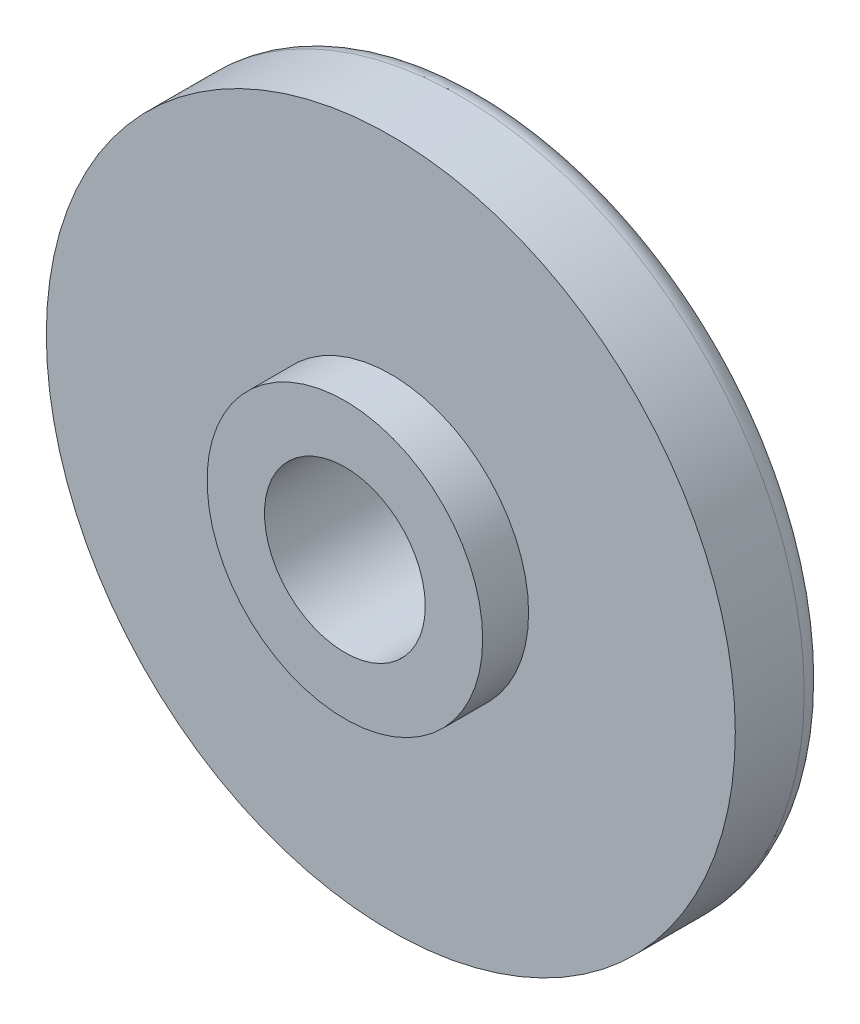
ISO-10303-21;
HEADER;
FILE_DESCRIPTION(('STEP AP214'),'2;1');
FILE_NAME('part.step','',(''),(''),'','','');
FILE_SCHEMA(('AUTOMOTIVE_DESIGN { 1 0 10303 214 1 1 1 1 }'));
ENDSEC;
DATA;
#1=APPLICATION_CONTEXT('core data for automotive mechanical design processes');
#2=APPLICATION_PROTOCOL_DEFINITION('international standard','automotive_design',2000,#1);
#3=PRODUCT_CONTEXT('',#1,'mechanical');
#4=PRODUCT('Part','Part','',(#3));
#5=PRODUCT_RELATED_PRODUCT_CATEGORY('part','',(#4));
#6=PRODUCT_DEFINITION_FORMATION('','',#4);
#7=PRODUCT_DEFINITION_CONTEXT('part definition',#1,'design');
#8=PRODUCT_DEFINITION('design','',#6,#7);
#9=PRODUCT_DEFINITION_SHAPE('','',#8);
#10=(LENGTH_UNIT() NAMED_UNIT(*) SI_UNIT(.MILLI.,.METRE.));
#11=(NAMED_UNIT(*) PLANE_ANGLE_UNIT() SI_UNIT($,.RADIAN.));
#12=(NAMED_UNIT(*) SI_UNIT($,.STERADIAN.) SOLID_ANGLE_UNIT());
#13=UNCERTAINTY_MEASURE_WITH_UNIT(LENGTH_MEASURE(1.E-05),#10,'distance_accuracy_value','');
#14=(GEOMETRIC_REPRESENTATION_CONTEXT(3) GLOBAL_UNCERTAINTY_ASSIGNED_CONTEXT((#13)) GLOBAL_UNIT_ASSIGNED_CONTEXT((#10,
#11,#12)) REPRESENTATION_CONTEXT('',''));
#15=CARTESIAN_POINT('',(0.,0.,0.));
#16=DIRECTION('',(0.,0.,1.));
#17=DIRECTION('',(1.,0.,0.));
#18=AXIS2_PLACEMENT_3D('',#15,#16,#17);
#19=CARTESIAN_POINT('',(0.,0.,2.));
#20=DIRECTION('',(0.,0.,1.));
#21=DIRECTION('',(1.,0.,0.));
#22=AXIS2_PLACEMENT_3D('',#19,#20,#21);
#23=PLANE('',#22);
#24=CARTESIAN_POINT('',(0.,0.,2.));
#25=DIRECTION('',(0.,0.,1.));
#26=DIRECTION('',(1.,0.,0.));
#27=AXIS2_PLACEMENT_3D('',#24,#25,#26);
#28=CIRCLE('',#27,7.5);
#29=CARTESIAN_POINT('',(7.5,0.,2.));
#30=VERTEX_POINT('',#29);
#31=EDGE_CURVE('E46',#30,#30,#28,.T.);
#32=ORIENTED_EDGE('',*,*,#31,.T.);
#33=EDGE_LOOP('',(#32));
#34=FACE_BOUND('',#33,.T.);
#35=CARTESIAN_POINT('',(0.,0.,2.));
#36=DIRECTION('',(0.,0.,1.));
#37=DIRECTION('',(1.,0.,0.));
#38=AXIS2_PLACEMENT_3D('',#35,#36,#37);
#39=CIRCLE('',#38,3.);
#40=CARTESIAN_POINT('',(3.,0.,2.));
#41=VERTEX_POINT('',#40);
#42=EDGE_CURVE('E56',#41,#41,#39,.T.);
#43=ORIENTED_EDGE('',*,*,#42,.F.);
#44=EDGE_LOOP('',(#43));
#45=FACE_BOUND('',#44,.T.);
#46=ADVANCED_FACE('F35',(#34,#45),#23,.T.);
#47=CARTESIAN_POINT('',(0.,0.,0.));
#48=DIRECTION('',(0.,0.,1.));
#49=DIRECTION('',(1.,0.,0.));
#50=AXIS2_PLACEMENT_3D('',#47,#48,#49);
#51=PLANE('',#50);
#52=CARTESIAN_POINT('',(0.,0.,0.));
#53=DIRECTION('',(0.,0.,1.));
#54=DIRECTION('',(1.,0.,0.));
#55=AXIS2_PLACEMENT_3D('',#52,#53,#54);
#56=CIRCLE('',#55,7.);
#57=CARTESIAN_POINT('',(7.,0.,0.));
#58=VERTEX_POINT('',#57);
#59=EDGE_CURVE('E10',#58,#58,#56,.F.);
#60=ORIENTED_EDGE('',*,*,#59,.T.);
#61=EDGE_LOOP('',(#60));
#62=FACE_BOUND('',#61,.T.);
#63=CARTESIAN_POINT('',(0.,0.,0.));
#64=DIRECTION('',(0.,0.,1.));
#65=DIRECTION('',(1.,0.,0.));
#66=AXIS2_PLACEMENT_3D('',#63,#64,#65);
#67=CIRCLE('',#66,1.75);
#68=CARTESIAN_POINT('',(1.75,0.,0.));
#69=VERTEX_POINT('',#68);
#70=EDGE_CURVE('E50',#69,#69,#67,.T.);
#71=ORIENTED_EDGE('',*,*,#70,.T.);
#72=EDGE_LOOP('',(#71));
#73=FACE_BOUND('',#72,.T.);
#74=ADVANCED_FACE('F82',(#62,#73),#51,.F.);
#75=CARTESIAN_POINT('',(0.,0.,2.));
#76=DIRECTION('',(0.,0.,-1.));
#77=DIRECTION('',(-1.,0.,0.));
#78=AXIS2_PLACEMENT_3D('',#75,#76,#77);
#79=CYLINDRICAL_SURFACE('',#78,7.5);
#80=CARTESIAN_POINT('',(0.,0.,0.5));
#81=DIRECTION('',(0.,0.,1.));
#82=DIRECTION('',(1.,0.,0.));
#83=AXIS2_PLACEMENT_3D('',#80,#81,#82);
#84=CIRCLE('',#83,7.5);
#85=CARTESIAN_POINT('',(7.5,0.,0.5));
#86=VERTEX_POINT('',#85);
#87=EDGE_CURVE('E42',#86,#86,#84,.T.);
#88=ORIENTED_EDGE('',*,*,#87,.T.);
#89=EDGE_LOOP('',(#88));
#90=FACE_BOUND('',#89,.T.);
#91=ORIENTED_EDGE('',*,*,#31,.F.);
#92=EDGE_LOOP('',(#91));
#93=FACE_BOUND('',#92,.T.);
#94=ADVANCED_FACE('F78',(#90,#93),#79,.T.);
#95=CARTESIAN_POINT('',(0.,0.,2.));
#96=DIRECTION('',(0.,0.,-1.));
#97=DIRECTION('',(-1.,0.,0.));
#98=AXIS2_PLACEMENT_3D('',#95,#96,#97);
#99=CYLINDRICAL_SURFACE('',#98,1.75);
#100=ORIENTED_EDGE('',*,*,#70,.F.);
#101=EDGE_LOOP('',(#100));
#102=FACE_BOUND('',#101,.T.);
#103=CARTESIAN_POINT('',(0.,0.,3.));
#104=DIRECTION('',(0.,0.,1.));
#105=DIRECTION('',(1.,0.,0.));
#106=AXIS2_PLACEMENT_3D('',#103,#104,#105);
#107=CIRCLE('',#106,1.75);
#108=CARTESIAN_POINT('',(1.75,0.,3.));
#109=VERTEX_POINT('',#108);
#110=EDGE_CURVE('E59',#109,#109,#107,.T.);
#111=ORIENTED_EDGE('',*,*,#110,.T.);
#112=EDGE_LOOP('',(#111));
#113=FACE_BOUND('',#112,.T.);
#114=ADVANCED_FACE('F65',(#102,#113),#99,.F.);
#115=CARTESIAN_POINT('',(0.,0.,3.));
#116=DIRECTION('',(0.,0.,1.));
#117=DIRECTION('',(1.,0.,0.));
#118=AXIS2_PLACEMENT_3D('',#115,#116,#117);
#119=PLANE('',#118);
#120=CARTESIAN_POINT('',(0.,0.,3.));
#121=DIRECTION('',(0.,0.,1.));
#122=DIRECTION('',(1.,0.,0.));
#123=AXIS2_PLACEMENT_3D('',#120,#121,#122);
#124=CIRCLE('',#123,3.);
#125=CARTESIAN_POINT('',(3.,0.,3.));
#126=VERTEX_POINT('',#125);
#127=EDGE_CURVE('E55',#126,#126,#124,.T.);
#128=ORIENTED_EDGE('',*,*,#127,.T.);
#129=EDGE_LOOP('',(#128));
#130=FACE_BOUND('',#129,.T.);
#131=ORIENTED_EDGE('',*,*,#110,.F.);
#132=EDGE_LOOP('',(#131));
#133=FACE_BOUND('',#132,.T.);
#134=ADVANCED_FACE('F67',(#130,#133),#119,.T.);
#135=CARTESIAN_POINT('',(0.,0.,3.));
#136=DIRECTION('',(0.,0.,-1.));
#137=DIRECTION('',(-1.,0.,0.));
#138=AXIS2_PLACEMENT_3D('',#135,#136,#137);
#139=CYLINDRICAL_SURFACE('',#138,3.);
#140=ORIENTED_EDGE('',*,*,#127,.F.);
#141=EDGE_LOOP('',(#140));
#142=FACE_BOUND('',#141,.T.);
#143=ORIENTED_EDGE('',*,*,#42,.T.);
#144=EDGE_LOOP('',(#143));
#145=FACE_BOUND('',#144,.T.);
#146=ADVANCED_FACE('F69',(#142,#145),#139,.T.);
#147=CARTESIAN_POINT('',(0.,0.,0.5));
#148=DIRECTION('',(0.,0.,1.));
#149=DIRECTION('',(1.,0.,0.));
#150=AXIS2_PLACEMENT_3D('',#147,#148,#149);
#151=TOROIDAL_SURFACE('',#150,7.,0.5);
#152=ORIENTED_EDGE('',*,*,#59,.F.);
#153=EDGE_LOOP('',(#152));
#154=FACE_BOUND('',#153,.T.);
#155=ORIENTED_EDGE('',*,*,#87,.F.);
#156=EDGE_LOOP('',(#155));
#157=FACE_BOUND('',#156,.T.);
#158=ADVANCED_FACE('F37',(#154,#157),#151,.T.);
#159=CLOSED_SHELL('',(#46,#74,#94,#114,#134,#146,#158));
#160=MANIFOLD_SOLID_BREP('B2',#159);
#161=ADVANCED_BREP_SHAPE_REPRESENTATION('',(#18,#160),#14);
#162=SHAPE_DEFINITION_REPRESENTATION(#9,#161);
ENDSEC;
END-ISO-10303-21;
